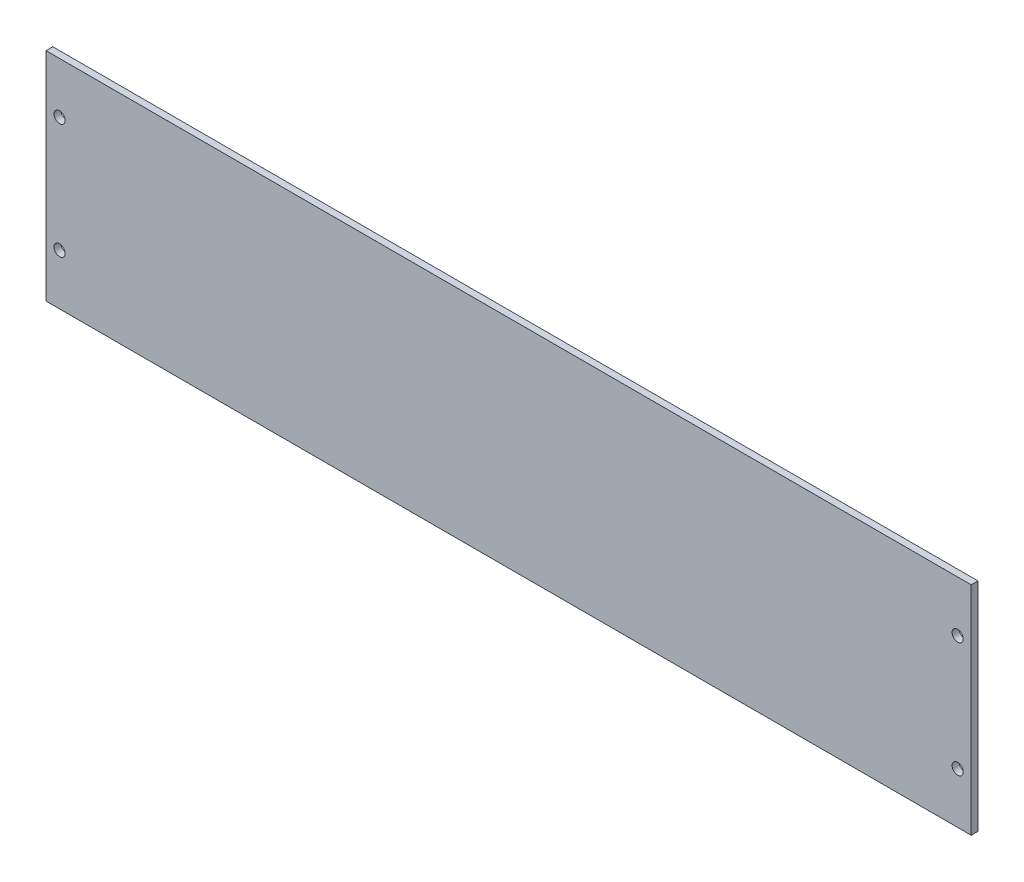
ISO-10303-21;
HEADER;
FILE_DESCRIPTION(('STEP AP214'),'2;1');
FILE_NAME('part.step','',(''),(''),'','','');
FILE_SCHEMA(('AUTOMOTIVE_DESIGN { 1 0 10303 214 1 1 1 1 }'));
ENDSEC;
DATA;
#1=APPLICATION_CONTEXT('core data for automotive mechanical design processes');
#2=APPLICATION_PROTOCOL_DEFINITION('international standard','automotive_design',2000,#1);
#3=PRODUCT_CONTEXT('',#1,'mechanical');
#4=PRODUCT('Part','Part','',(#3));
#5=PRODUCT_RELATED_PRODUCT_CATEGORY('part','',(#4));
#6=PRODUCT_DEFINITION_FORMATION('','',#4);
#7=PRODUCT_DEFINITION_CONTEXT('part definition',#1,'design');
#8=PRODUCT_DEFINITION('design','',#6,#7);
#9=PRODUCT_DEFINITION_SHAPE('','',#8);
#10=(LENGTH_UNIT() NAMED_UNIT(*) SI_UNIT(.MILLI.,.METRE.));
#11=(NAMED_UNIT(*) PLANE_ANGLE_UNIT() SI_UNIT($,.RADIAN.));
#12=(NAMED_UNIT(*) SI_UNIT($,.STERADIAN.) SOLID_ANGLE_UNIT());
#13=UNCERTAINTY_MEASURE_WITH_UNIT(LENGTH_MEASURE(1.E-05),#10,'distance_accuracy_value','');
#14=(GEOMETRIC_REPRESENTATION_CONTEXT(3) GLOBAL_UNCERTAINTY_ASSIGNED_CONTEXT((#13)) GLOBAL_UNIT_ASSIGNED_CONTEXT((#10,
#11,#12)) REPRESENTATION_CONTEXT('',''));
#15=CARTESIAN_POINT('',(0.,0.,0.));
#16=DIRECTION('',(0.,0.,1.));
#17=DIRECTION('',(1.,0.,0.));
#18=AXIS2_PLACEMENT_3D('',#15,#16,#17);
#19=CARTESIAN_POINT('',(273.,-64.,4.));
#20=DIRECTION('',(-1.,0.,0.));
#21=DIRECTION('',(0.,0.,1.));
#22=AXIS2_PLACEMENT_3D('',#19,#20,#21);
#23=PLANE('',#22);
#24=DIRECTION('',(0.,1.,0.));
#25=VECTOR('',#24,1.);
#26=CARTESIAN_POINT('',(273.,-64.,0.));
#27=LINE('',#26,#25);
#28=CARTESIAN_POINT('',(273.,-64.,0.));
#29=VERTEX_POINT('',#28);
#30=CARTESIAN_POINT('',(273.,64.,0.));
#31=VERTEX_POINT('',#30);
#32=EDGE_CURVE('E96',#29,#31,#27,.T.);
#33=ORIENTED_EDGE('',*,*,#32,.T.);
#34=DIRECTION('',(0.,0.,-1.));
#35=VECTOR('',#34,1.);
#36=CARTESIAN_POINT('',(273.,64.,4.));
#37=LINE('',#36,#35);
#38=CARTESIAN_POINT('',(273.,64.,4.));
#39=VERTEX_POINT('',#38);
#40=EDGE_CURVE('E11',#39,#31,#37,.T.);
#41=ORIENTED_EDGE('',*,*,#40,.F.);
#42=DIRECTION('',(0.,1.,0.));
#43=VECTOR('',#42,1.);
#44=CARTESIAN_POINT('',(273.,-64.,4.));
#45=LINE('',#44,#43);
#46=CARTESIAN_POINT('',(273.,-64.,4.));
#47=VERTEX_POINT('',#46);
#48=EDGE_CURVE('E84',#47,#39,#45,.T.);
#49=ORIENTED_EDGE('',*,*,#48,.F.);
#50=DIRECTION('',(0.,0.,-1.));
#51=VECTOR('',#50,1.);
#52=CARTESIAN_POINT('',(273.,-64.,4.));
#53=LINE('',#52,#51);
#54=EDGE_CURVE('E92',#47,#29,#53,.T.);
#55=ORIENTED_EDGE('',*,*,#54,.T.);
#56=EDGE_LOOP('',(#33,#41,#49,#55));
#57=FACE_BOUND('',#56,.T.);
#58=ADVANCED_FACE('F33',(#57),#23,.F.);
#59=CARTESIAN_POINT('',(-273.,64.,4.));
#60=DIRECTION('',(0.,-1.,0.));
#61=DIRECTION('',(0.,0.,-1.));
#62=AXIS2_PLACEMENT_3D('',#59,#60,#61);
#63=PLANE('',#62);
#64=DIRECTION('',(-1.,0.,0.));
#65=VECTOR('',#64,1.);
#66=CARTESIAN_POINT('',(-273.,64.,0.));
#67=LINE('',#66,#65);
#68=CARTESIAN_POINT('',(-273.,64.,0.));
#69=VERTEX_POINT('',#68);
#70=EDGE_CURVE('E88',#31,#69,#67,.T.);
#71=ORIENTED_EDGE('',*,*,#70,.T.);
#72=DIRECTION('',(0.,0.,-1.));
#73=VECTOR('',#72,1.);
#74=CARTESIAN_POINT('',(-273.,64.,4.));
#75=LINE('',#74,#73);
#76=CARTESIAN_POINT('',(-273.,64.,4.));
#77=VERTEX_POINT('',#76);
#78=EDGE_CURVE('E41',#77,#69,#75,.T.);
#79=ORIENTED_EDGE('',*,*,#78,.F.);
#80=DIRECTION('',(-1.,0.,0.));
#81=VECTOR('',#80,1.);
#82=CARTESIAN_POINT('',(-273.,64.,4.));
#83=LINE('',#82,#81);
#84=EDGE_CURVE('E79',#39,#77,#83,.T.);
#85=ORIENTED_EDGE('',*,*,#84,.F.);
#86=ORIENTED_EDGE('',*,*,#40,.T.);
#87=EDGE_LOOP('',(#71,#79,#85,#86));
#88=FACE_BOUND('',#87,.T.);
#89=ADVANCED_FACE('F87',(#88),#63,.F.);
#90=CARTESIAN_POINT('',(-273.,-64.,4.));
#91=DIRECTION('',(1.,0.,0.));
#92=DIRECTION('',(0.,0.,-1.));
#93=AXIS2_PLACEMENT_3D('',#90,#91,#92);
#94=PLANE('',#93);
#95=DIRECTION('',(0.,-1.,0.));
#96=VECTOR('',#95,1.);
#97=CARTESIAN_POINT('',(-273.,-64.,0.));
#98=LINE('',#97,#96);
#99=CARTESIAN_POINT('',(-273.,-64.,0.));
#100=VERTEX_POINT('',#99);
#101=EDGE_CURVE('E66',#69,#100,#98,.T.);
#102=ORIENTED_EDGE('',*,*,#101,.T.);
#103=DIRECTION('',(0.,0.,-1.));
#104=VECTOR('',#103,1.);
#105=CARTESIAN_POINT('',(-273.,-64.,4.));
#106=LINE('',#105,#104);
#107=CARTESIAN_POINT('',(-273.,-64.,4.));
#108=VERTEX_POINT('',#107);
#109=EDGE_CURVE('E89',#108,#100,#106,.T.);
#110=ORIENTED_EDGE('',*,*,#109,.F.);
#111=DIRECTION('',(0.,-1.,0.));
#112=VECTOR('',#111,1.);
#113=CARTESIAN_POINT('',(-273.,-64.,4.));
#114=LINE('',#113,#112);
#115=EDGE_CURVE('E82',#77,#108,#114,.T.);
#116=ORIENTED_EDGE('',*,*,#115,.F.);
#117=ORIENTED_EDGE('',*,*,#78,.T.);
#118=EDGE_LOOP('',(#102,#110,#116,#117));
#119=FACE_BOUND('',#118,.T.);
#120=ADVANCED_FACE('F90',(#119),#94,.F.);
#121=CARTESIAN_POINT('',(-273.,-64.,4.));
#122=DIRECTION('',(0.,1.,0.));
#123=DIRECTION('',(0.,0.,1.));
#124=AXIS2_PLACEMENT_3D('',#121,#122,#123);
#125=PLANE('',#124);
#126=DIRECTION('',(1.,0.,0.));
#127=VECTOR('',#126,1.);
#128=CARTESIAN_POINT('',(-273.,-64.,0.));
#129=LINE('',#128,#127);
#130=EDGE_CURVE('E72',#100,#29,#129,.T.);
#131=ORIENTED_EDGE('',*,*,#130,.T.);
#132=ORIENTED_EDGE('',*,*,#54,.F.);
#133=DIRECTION('',(1.,0.,0.));
#134=VECTOR('',#133,1.);
#135=CARTESIAN_POINT('',(-273.,-64.,4.));
#136=LINE('',#135,#134);
#137=EDGE_CURVE('E49',#108,#47,#136,.T.);
#138=ORIENTED_EDGE('',*,*,#137,.F.);
#139=ORIENTED_EDGE('',*,*,#109,.T.);
#140=EDGE_LOOP('',(#131,#132,#138,#139));
#141=FACE_BOUND('',#140,.T.);
#142=ADVANCED_FACE('F104',(#141),#125,.F.);
#143=CARTESIAN_POINT('',(0.,0.,4.));
#144=DIRECTION('',(0.,0.,-1.));
#145=DIRECTION('',(-1.,0.,0.));
#146=AXIS2_PLACEMENT_3D('',#143,#144,#145);
#147=PLANE('',#146);
#148=CARTESIAN_POINT('',(-265.,34.,4.));
#149=DIRECTION('',(0.,0.,-1.));
#150=DIRECTION('',(-1.,0.,0.));
#151=AXIS2_PLACEMENT_3D('',#148,#149,#150);
#152=CIRCLE('',#151,3.29999999999997);
#153=CARTESIAN_POINT('',(-268.3,34.,4.));
#154=VERTEX_POINT('',#153);
#155=EDGE_CURVE('E127',#154,#154,#152,.T.);
#156=ORIENTED_EDGE('',*,*,#155,.T.);
#157=EDGE_LOOP('',(#156));
#158=FACE_BOUND('',#157,.T.);
#159=CARTESIAN_POINT('',(-265.,-34.,4.));
#160=DIRECTION('',(0.,0.,-1.));
#161=DIRECTION('',(-1.,0.,0.));
#162=AXIS2_PLACEMENT_3D('',#159,#160,#161);
#163=CIRCLE('',#162,3.29999999999997);
#164=CARTESIAN_POINT('',(-268.3,-34.,4.));
#165=VERTEX_POINT('',#164);
#166=EDGE_CURVE('E121',#165,#165,#163,.T.);
#167=ORIENTED_EDGE('',*,*,#166,.T.);
#168=EDGE_LOOP('',(#167));
#169=FACE_BOUND('',#168,.T.);
#170=CARTESIAN_POINT('',(265.,-34.,4.));
#171=DIRECTION('',(0.,0.,-1.));
#172=DIRECTION('',(-1.,0.,0.));
#173=AXIS2_PLACEMENT_3D('',#170,#171,#172);
#174=CIRCLE('',#173,3.29999999999997);
#175=CARTESIAN_POINT('',(261.7,-34.,4.));
#176=VERTEX_POINT('',#175);
#177=EDGE_CURVE('E115',#176,#176,#174,.T.);
#178=ORIENTED_EDGE('',*,*,#177,.T.);
#179=EDGE_LOOP('',(#178));
#180=FACE_BOUND('',#179,.T.);
#181=CARTESIAN_POINT('',(265.,34.,4.));
#182=DIRECTION('',(0.,0.,-1.));
#183=DIRECTION('',(-1.,0.,0.));
#184=AXIS2_PLACEMENT_3D('',#181,#182,#183);
#185=CIRCLE('',#184,3.29999999999997);
#186=CARTESIAN_POINT('',(261.7,34.,4.));
#187=VERTEX_POINT('',#186);
#188=EDGE_CURVE('E99',#187,#187,#185,.T.);
#189=ORIENTED_EDGE('',*,*,#188,.T.);
#190=EDGE_LOOP('',(#189));
#191=FACE_BOUND('',#190,.T.);
#192=ORIENTED_EDGE('',*,*,#48,.T.);
#193=ORIENTED_EDGE('',*,*,#84,.T.);
#194=ORIENTED_EDGE('',*,*,#115,.T.);
#195=ORIENTED_EDGE('',*,*,#137,.T.);
#196=EDGE_LOOP('',(#192,#193,#194,#195));
#197=FACE_BOUND('',#196,.T.);
#198=ADVANCED_FACE('F80',(#158,#169,#180,#191,#197),#147,.F.);
#199=CARTESIAN_POINT('',(0.,0.,0.));
#200=DIRECTION('',(0.,0.,-1.));
#201=DIRECTION('',(-1.,0.,0.));
#202=AXIS2_PLACEMENT_3D('',#199,#200,#201);
#203=PLANE('',#202);
#204=CARTESIAN_POINT('',(-265.,34.,0.));
#205=DIRECTION('',(0.,0.,-1.));
#206=DIRECTION('',(-1.,0.,0.));
#207=AXIS2_PLACEMENT_3D('',#204,#205,#206);
#208=CIRCLE('',#207,3.29999999999997);
#209=CARTESIAN_POINT('',(-268.3,34.,0.));
#210=VERTEX_POINT('',#209);
#211=EDGE_CURVE('E130',#210,#210,#208,.T.);
#212=ORIENTED_EDGE('',*,*,#211,.F.);
#213=EDGE_LOOP('',(#212));
#214=FACE_BOUND('',#213,.T.);
#215=CARTESIAN_POINT('',(-265.,-34.,0.));
#216=DIRECTION('',(0.,0.,-1.));
#217=DIRECTION('',(-1.,0.,0.));
#218=AXIS2_PLACEMENT_3D('',#215,#216,#217);
#219=CIRCLE('',#218,3.29999999999997);
#220=CARTESIAN_POINT('',(-268.3,-34.,0.));
#221=VERTEX_POINT('',#220);
#222=EDGE_CURVE('E124',#221,#221,#219,.T.);
#223=ORIENTED_EDGE('',*,*,#222,.F.);
#224=EDGE_LOOP('',(#223));
#225=FACE_BOUND('',#224,.T.);
#226=CARTESIAN_POINT('',(265.,-34.,0.));
#227=DIRECTION('',(0.,0.,-1.));
#228=DIRECTION('',(-1.,0.,0.));
#229=AXIS2_PLACEMENT_3D('',#226,#227,#228);
#230=CIRCLE('',#229,3.29999999999997);
#231=CARTESIAN_POINT('',(261.7,-34.,0.));
#232=VERTEX_POINT('',#231);
#233=EDGE_CURVE('E118',#232,#232,#230,.T.);
#234=ORIENTED_EDGE('',*,*,#233,.F.);
#235=EDGE_LOOP('',(#234));
#236=FACE_BOUND('',#235,.T.);
#237=CARTESIAN_POINT('',(265.,34.,0.));
#238=DIRECTION('',(0.,0.,-1.));
#239=DIRECTION('',(-1.,0.,0.));
#240=AXIS2_PLACEMENT_3D('',#237,#238,#239);
#241=CIRCLE('',#240,3.29999999999997);
#242=CARTESIAN_POINT('',(261.7,34.,0.));
#243=VERTEX_POINT('',#242);
#244=EDGE_CURVE('E112',#243,#243,#241,.T.);
#245=ORIENTED_EDGE('',*,*,#244,.F.);
#246=EDGE_LOOP('',(#245));
#247=FACE_BOUND('',#246,.T.);
#248=ORIENTED_EDGE('',*,*,#32,.F.);
#249=ORIENTED_EDGE('',*,*,#130,.F.);
#250=ORIENTED_EDGE('',*,*,#101,.F.);
#251=ORIENTED_EDGE('',*,*,#70,.F.);
#252=EDGE_LOOP('',(#248,#249,#250,#251));
#253=FACE_BOUND('',#252,.T.);
#254=ADVANCED_FACE('F107',(#214,#225,#236,#247,#253),#203,.T.);
#255=CARTESIAN_POINT('',(265.,34.,0.));
#256=DIRECTION('',(0.,0.,-1.));
#257=DIRECTION('',(-1.,0.,0.));
#258=AXIS2_PLACEMENT_3D('',#255,#256,#257);
#259=CYLINDRICAL_SURFACE('',#258,3.29999999999997);
#260=ORIENTED_EDGE('',*,*,#188,.F.);
#261=EDGE_LOOP('',(#260));
#262=FACE_BOUND('',#261,.T.);
#263=ORIENTED_EDGE('',*,*,#244,.T.);
#264=EDGE_LOOP('',(#263));
#265=FACE_BOUND('',#264,.T.);
#266=ADVANCED_FACE('F138',(#262,#265),#259,.F.);
#267=CARTESIAN_POINT('',(265.,-34.,0.));
#268=DIRECTION('',(0.,0.,-1.));
#269=DIRECTION('',(-1.,0.,0.));
#270=AXIS2_PLACEMENT_3D('',#267,#268,#269);
#271=CYLINDRICAL_SURFACE('',#270,3.29999999999997);
#272=ORIENTED_EDGE('',*,*,#177,.F.);
#273=EDGE_LOOP('',(#272));
#274=FACE_BOUND('',#273,.T.);
#275=ORIENTED_EDGE('',*,*,#233,.T.);
#276=EDGE_LOOP('',(#275));
#277=FACE_BOUND('',#276,.T.);
#278=ADVANCED_FACE('F147',(#274,#277),#271,.F.);
#279=CARTESIAN_POINT('',(-265.,-34.,0.));
#280=DIRECTION('',(0.,0.,-1.));
#281=DIRECTION('',(-1.,0.,0.));
#282=AXIS2_PLACEMENT_3D('',#279,#280,#281);
#283=CYLINDRICAL_SURFACE('',#282,3.29999999999997);
#284=ORIENTED_EDGE('',*,*,#166,.F.);
#285=EDGE_LOOP('',(#284));
#286=FACE_BOUND('',#285,.T.);
#287=ORIENTED_EDGE('',*,*,#222,.T.);
#288=EDGE_LOOP('',(#287));
#289=FACE_BOUND('',#288,.T.);
#290=ADVANCED_FACE('F153',(#286,#289),#283,.F.);
#291=CARTESIAN_POINT('',(-265.,34.,0.));
#292=DIRECTION('',(0.,0.,-1.));
#293=DIRECTION('',(-1.,0.,0.));
#294=AXIS2_PLACEMENT_3D('',#291,#292,#293);
#295=CYLINDRICAL_SURFACE('',#294,3.29999999999997);
#296=ORIENTED_EDGE('',*,*,#155,.F.);
#297=EDGE_LOOP('',(#296));
#298=FACE_BOUND('',#297,.T.);
#299=ORIENTED_EDGE('',*,*,#211,.T.);
#300=EDGE_LOOP('',(#299));
#301=FACE_BOUND('',#300,.T.);
#302=ADVANCED_FACE('F134',(#298,#301),#295,.F.);
#303=CLOSED_SHELL('',(#58,#89,#120,#142,#198,#254,#266,#278,#290,#302));
#304=MANIFOLD_SOLID_BREP('B2',#303);
#305=ADVANCED_BREP_SHAPE_REPRESENTATION('',(#18,#304),#14);
#306=SHAPE_DEFINITION_REPRESENTATION(#9,#305);
ENDSEC;
END-ISO-10303-21;
